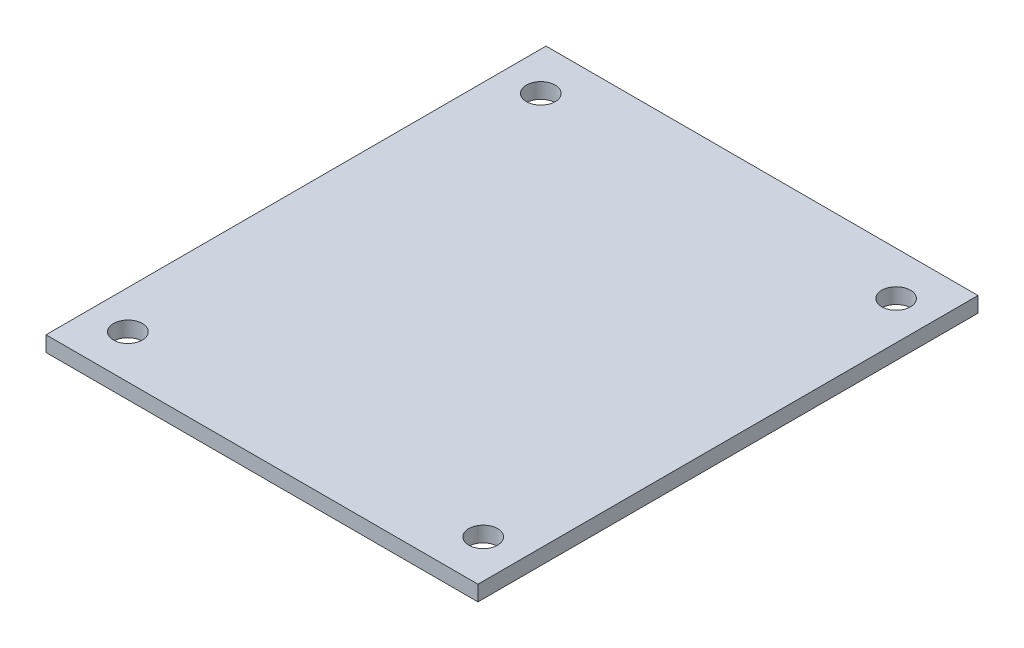
ISO-10303-21;
HEADER;
FILE_DESCRIPTION(('STEP AP214'),'2;1');
FILE_NAME('part.step','',(''),(''),'','','');
FILE_SCHEMA(('AUTOMOTIVE_DESIGN { 1 0 10303 214 1 1 1 1 }'));
ENDSEC;
DATA;
#1=APPLICATION_CONTEXT('core data for automotive mechanical design processes');
#2=APPLICATION_PROTOCOL_DEFINITION('international standard','automotive_design',2000,#1);
#3=PRODUCT_CONTEXT('',#1,'mechanical');
#4=PRODUCT('Part','Part','',(#3));
#5=PRODUCT_RELATED_PRODUCT_CATEGORY('part','',(#4));
#6=PRODUCT_DEFINITION_FORMATION('','',#4);
#7=PRODUCT_DEFINITION_CONTEXT('part definition',#1,'design');
#8=PRODUCT_DEFINITION('design','',#6,#7);
#9=PRODUCT_DEFINITION_SHAPE('','',#8);
#10=(LENGTH_UNIT() NAMED_UNIT(*) SI_UNIT(.MILLI.,.METRE.));
#11=(NAMED_UNIT(*) PLANE_ANGLE_UNIT() SI_UNIT($,.RADIAN.));
#12=(NAMED_UNIT(*) SI_UNIT($,.STERADIAN.) SOLID_ANGLE_UNIT());
#13=UNCERTAINTY_MEASURE_WITH_UNIT(LENGTH_MEASURE(1.E-05),#10,'distance_accuracy_value','');
#14=(GEOMETRIC_REPRESENTATION_CONTEXT(3) GLOBAL_UNCERTAINTY_ASSIGNED_CONTEXT((#13)) GLOBAL_UNIT_ASSIGNED_CONTEXT((#10,
#11,#12)) REPRESENTATION_CONTEXT('',''));
#15=CARTESIAN_POINT('',(0.,0.,0.));
#16=DIRECTION('',(0.,0.,1.));
#17=DIRECTION('',(1.,0.,0.));
#18=AXIS2_PLACEMENT_3D('',#15,#16,#17);
#19=CARTESIAN_POINT('',(0.,1.6,0.));
#20=DIRECTION('',(0.,-1.,0.));
#21=DIRECTION('',(0.,0.,-1.));
#22=AXIS2_PLACEMENT_3D('',#19,#20,#21);
#23=PLANE('',#22);
#24=DIRECTION('',(0.,0.,1.));
#25=VECTOR('',#24,1.);
#26=CARTESIAN_POINT('',(0.,1.6,0.));
#27=LINE('',#26,#25);
#28=CARTESIAN_POINT('',(0.,1.6,-52.07));
#29=VERTEX_POINT('',#28);
#30=CARTESIAN_POINT('',(0.,1.6,0.));
#31=VERTEX_POINT('',#30);
#32=EDGE_CURVE('E88',#29,#31,#27,.T.);
#33=ORIENTED_EDGE('',*,*,#32,.T.);
#34=DIRECTION('',(1.,0.,0.));
#35=VECTOR('',#34,1.);
#36=CARTESIAN_POINT('',(0.,1.6,0.));
#37=LINE('',#36,#35);
#38=CARTESIAN_POINT('',(44.9834,1.6,0.));
#39=VERTEX_POINT('',#38);
#40=EDGE_CURVE('E83',#31,#39,#37,.T.);
#41=ORIENTED_EDGE('',*,*,#40,.T.);
#42=DIRECTION('',(0.,0.,-1.));
#43=VECTOR('',#42,1.);
#44=CARTESIAN_POINT('',(44.9834,1.6,0.));
#45=LINE('',#44,#43);
#46=CARTESIAN_POINT('',(44.9834,1.6,-52.07));
#47=VERTEX_POINT('',#46);
#48=EDGE_CURVE('E86',#39,#47,#45,.T.);
#49=ORIENTED_EDGE('',*,*,#48,.T.);
#50=DIRECTION('',(-1.,0.,0.));
#51=VECTOR('',#50,1.);
#52=CARTESIAN_POINT('',(0.,1.6,-52.07));
#53=LINE('',#52,#51);
#54=EDGE_CURVE('E53',#47,#29,#53,.T.);
#55=ORIENTED_EDGE('',*,*,#54,.T.);
#56=EDGE_LOOP('',(#33,#41,#49,#55));
#57=FACE_BOUND('',#56,.T.);
#58=CARTESIAN_POINT('',(3.9917,1.6,-47.535));
#59=DIRECTION('',(0.,1.,0.));
#60=DIRECTION('',(0.,0.,1.));
#61=AXIS2_PLACEMENT_3D('',#58,#59,#60);
#62=CIRCLE('',#61,1.5);
#63=CARTESIAN_POINT('',(3.9917,1.6,-46.035));
#64=VERTEX_POINT('',#63);
#65=EDGE_CURVE('E103',#64,#64,#62,.T.);
#66=ORIENTED_EDGE('',*,*,#65,.F.);
#67=EDGE_LOOP('',(#66));
#68=FACE_BOUND('',#67,.T.);
#69=CARTESIAN_POINT('',(40.9917,1.6,-47.535));
#70=DIRECTION('',(0.,1.,0.));
#71=DIRECTION('',(0.,0.,1.));
#72=AXIS2_PLACEMENT_3D('',#69,#70,#71);
#73=CIRCLE('',#72,1.5);
#74=CARTESIAN_POINT('',(40.9917,1.6,-46.035));
#75=VERTEX_POINT('',#74);
#76=EDGE_CURVE('E118',#75,#75,#73,.T.);
#77=ORIENTED_EDGE('',*,*,#76,.F.);
#78=EDGE_LOOP('',(#77));
#79=FACE_BOUND('',#78,.T.);
#80=CARTESIAN_POINT('',(40.9917,1.6,-4.535));
#81=DIRECTION('',(0.,1.,0.));
#82=DIRECTION('',(0.,0.,1.));
#83=AXIS2_PLACEMENT_3D('',#80,#81,#82);
#84=CIRCLE('',#83,1.5);
#85=CARTESIAN_POINT('',(40.9917,1.6,-3.03499999999999));
#86=VERTEX_POINT('',#85);
#87=EDGE_CURVE('E124',#86,#86,#84,.T.);
#88=ORIENTED_EDGE('',*,*,#87,.F.);
#89=EDGE_LOOP('',(#88));
#90=FACE_BOUND('',#89,.T.);
#91=CARTESIAN_POINT('',(3.9917,1.6,-4.535));
#92=DIRECTION('',(0.,1.,0.));
#93=DIRECTION('',(0.,0.,1.));
#94=AXIS2_PLACEMENT_3D('',#91,#92,#93);
#95=CIRCLE('',#94,1.5);
#96=CARTESIAN_POINT('',(3.9917,1.6,-3.035));
#97=VERTEX_POINT('',#96);
#98=EDGE_CURVE('E130',#97,#97,#95,.T.);
#99=ORIENTED_EDGE('',*,*,#98,.F.);
#100=EDGE_LOOP('',(#99));
#101=FACE_BOUND('',#100,.T.);
#102=ADVANCED_FACE('F36',(#57,#68,#79,#90,#101),#23,.F.);
#103=CARTESIAN_POINT('',(0.,0.,0.));
#104=DIRECTION('',(0.,-1.,0.));
#105=DIRECTION('',(0.,0.,-1.));
#106=AXIS2_PLACEMENT_3D('',#103,#104,#105);
#107=PLANE('',#106);
#108=CARTESIAN_POINT('',(40.9917,0.,-4.535));
#109=DIRECTION('',(0.,1.,0.));
#110=DIRECTION('',(0.,0.,1.));
#111=AXIS2_PLACEMENT_3D('',#108,#109,#110);
#112=CIRCLE('',#111,1.5);
#113=CARTESIAN_POINT('',(40.9917,0.,-3.03499999999999));
#114=VERTEX_POINT('',#113);
#115=EDGE_CURVE('E127',#114,#114,#112,.T.);
#116=ORIENTED_EDGE('',*,*,#115,.T.);
#117=EDGE_LOOP('',(#116));
#118=FACE_BOUND('',#117,.T.);
#119=CARTESIAN_POINT('',(3.9917,0.,-47.535));
#120=DIRECTION('',(0.,1.,0.));
#121=DIRECTION('',(0.,0.,1.));
#122=AXIS2_PLACEMENT_3D('',#119,#120,#121);
#123=CIRCLE('',#122,1.5);
#124=CARTESIAN_POINT('',(3.9917,0.,-46.035));
#125=VERTEX_POINT('',#124);
#126=EDGE_CURVE('E115',#125,#125,#123,.T.);
#127=ORIENTED_EDGE('',*,*,#126,.T.);
#128=EDGE_LOOP('',(#127));
#129=FACE_BOUND('',#128,.T.);
#130=DIRECTION('',(0.,0.,1.));
#131=VECTOR('',#130,1.);
#132=CARTESIAN_POINT('',(0.,0.,0.));
#133=LINE('',#132,#131);
#134=CARTESIAN_POINT('',(0.,0.,-52.07));
#135=VERTEX_POINT('',#134);
#136=CARTESIAN_POINT('',(0.,0.,0.));
#137=VERTEX_POINT('',#136);
#138=EDGE_CURVE('E100',#135,#137,#133,.T.);
#139=ORIENTED_EDGE('',*,*,#138,.F.);
#140=DIRECTION('',(-1.,0.,0.));
#141=VECTOR('',#140,1.);
#142=CARTESIAN_POINT('',(0.,0.,-52.07));
#143=LINE('',#142,#141);
#144=CARTESIAN_POINT('',(44.9834,0.,-52.07));
#145=VERTEX_POINT('',#144);
#146=EDGE_CURVE('E76',#145,#135,#143,.T.);
#147=ORIENTED_EDGE('',*,*,#146,.F.);
#148=DIRECTION('',(0.,0.,-1.));
#149=VECTOR('',#148,1.);
#150=CARTESIAN_POINT('',(44.9834,0.,0.));
#151=LINE('',#150,#149);
#152=CARTESIAN_POINT('',(44.9834,0.,0.));
#153=VERTEX_POINT('',#152);
#154=EDGE_CURVE('E70',#153,#145,#151,.T.);
#155=ORIENTED_EDGE('',*,*,#154,.F.);
#156=DIRECTION('',(1.,0.,0.));
#157=VECTOR('',#156,1.);
#158=CARTESIAN_POINT('',(0.,0.,0.));
#159=LINE('',#158,#157);
#160=EDGE_CURVE('E92',#137,#153,#159,.T.);
#161=ORIENTED_EDGE('',*,*,#160,.F.);
#162=EDGE_LOOP('',(#139,#147,#155,#161));
#163=FACE_BOUND('',#162,.T.);
#164=CARTESIAN_POINT('',(40.9917,0.,-47.535));
#165=DIRECTION('',(0.,1.,0.));
#166=DIRECTION('',(0.,0.,1.));
#167=AXIS2_PLACEMENT_3D('',#164,#165,#166);
#168=CIRCLE('',#167,1.5);
#169=CARTESIAN_POINT('',(40.9917,0.,-46.035));
#170=VERTEX_POINT('',#169);
#171=EDGE_CURVE('E121',#170,#170,#168,.T.);
#172=ORIENTED_EDGE('',*,*,#171,.T.);
#173=EDGE_LOOP('',(#172));
#174=FACE_BOUND('',#173,.T.);
#175=CARTESIAN_POINT('',(3.9917,0.,-4.535));
#176=DIRECTION('',(0.,1.,0.));
#177=DIRECTION('',(0.,0.,1.));
#178=AXIS2_PLACEMENT_3D('',#175,#176,#177);
#179=CIRCLE('',#178,1.5);
#180=CARTESIAN_POINT('',(3.9917,0.,-3.035));
#181=VERTEX_POINT('',#180);
#182=EDGE_CURVE('E133',#181,#181,#179,.T.);
#183=ORIENTED_EDGE('',*,*,#182,.T.);
#184=EDGE_LOOP('',(#183));
#185=FACE_BOUND('',#184,.T.);
#186=ADVANCED_FACE('F111',(#118,#129,#163,#174,#185),#107,.T.);
#187=CARTESIAN_POINT('',(0.,1.6,0.));
#188=DIRECTION('',(1.,0.,0.));
#189=DIRECTION('',(0.,0.,-1.));
#190=AXIS2_PLACEMENT_3D('',#187,#188,#189);
#191=PLANE('',#190);
#192=ORIENTED_EDGE('',*,*,#138,.T.);
#193=DIRECTION('',(0.,-1.,0.));
#194=VECTOR('',#193,1.);
#195=CARTESIAN_POINT('',(0.,1.6,0.));
#196=LINE('',#195,#194);
#197=EDGE_CURVE('E11',#31,#137,#196,.T.);
#198=ORIENTED_EDGE('',*,*,#197,.F.);
#199=ORIENTED_EDGE('',*,*,#32,.F.);
#200=DIRECTION('',(0.,-1.,0.));
#201=VECTOR('',#200,1.);
#202=CARTESIAN_POINT('',(0.,1.6,-52.07));
#203=LINE('',#202,#201);
#204=EDGE_CURVE('E96',#29,#135,#203,.T.);
#205=ORIENTED_EDGE('',*,*,#204,.T.);
#206=EDGE_LOOP('',(#192,#198,#199,#205));
#207=FACE_BOUND('',#206,.T.);
#208=ADVANCED_FACE('F38',(#207),#191,.F.);
#209=CARTESIAN_POINT('',(0.,1.6,0.));
#210=DIRECTION('',(0.,0.,-1.));
#211=DIRECTION('',(-1.,0.,0.));
#212=AXIS2_PLACEMENT_3D('',#209,#210,#211);
#213=PLANE('',#212);
#214=ORIENTED_EDGE('',*,*,#160,.T.);
#215=DIRECTION('',(0.,-1.,0.));
#216=VECTOR('',#215,1.);
#217=CARTESIAN_POINT('',(44.9834,1.6,0.));
#218=LINE('',#217,#216);
#219=EDGE_CURVE('E45',#39,#153,#218,.T.);
#220=ORIENTED_EDGE('',*,*,#219,.F.);
#221=ORIENTED_EDGE('',*,*,#40,.F.);
#222=ORIENTED_EDGE('',*,*,#197,.T.);
#223=EDGE_LOOP('',(#214,#220,#221,#222));
#224=FACE_BOUND('',#223,.T.);
#225=ADVANCED_FACE('F91',(#224),#213,.F.);
#226=CARTESIAN_POINT('',(44.9834,1.6,0.));
#227=DIRECTION('',(-1.,0.,0.));
#228=DIRECTION('',(0.,0.,1.));
#229=AXIS2_PLACEMENT_3D('',#226,#227,#228);
#230=PLANE('',#229);
#231=ORIENTED_EDGE('',*,*,#154,.T.);
#232=DIRECTION('',(0.,-1.,0.));
#233=VECTOR('',#232,1.);
#234=CARTESIAN_POINT('',(44.9834,1.6,-52.07));
#235=LINE('',#234,#233);
#236=EDGE_CURVE('E93',#47,#145,#235,.T.);
#237=ORIENTED_EDGE('',*,*,#236,.F.);
#238=ORIENTED_EDGE('',*,*,#48,.F.);
#239=ORIENTED_EDGE('',*,*,#219,.T.);
#240=EDGE_LOOP('',(#231,#237,#238,#239));
#241=FACE_BOUND('',#240,.T.);
#242=ADVANCED_FACE('F94',(#241),#230,.F.);
#243=CARTESIAN_POINT('',(0.,1.6,-52.07));
#244=DIRECTION('',(0.,0.,1.));
#245=DIRECTION('',(1.,0.,0.));
#246=AXIS2_PLACEMENT_3D('',#243,#244,#245);
#247=PLANE('',#246);
#248=ORIENTED_EDGE('',*,*,#146,.T.);
#249=ORIENTED_EDGE('',*,*,#204,.F.);
#250=ORIENTED_EDGE('',*,*,#54,.F.);
#251=ORIENTED_EDGE('',*,*,#236,.T.);
#252=EDGE_LOOP('',(#248,#249,#250,#251));
#253=FACE_BOUND('',#252,.T.);
#254=ADVANCED_FACE('F108',(#253),#247,.F.);
#255=CARTESIAN_POINT('',(3.9917,1.6,-47.535));
#256=DIRECTION('',(0.,-1.,0.));
#257=DIRECTION('',(0.,0.,-1.));
#258=AXIS2_PLACEMENT_3D('',#255,#256,#257);
#259=CYLINDRICAL_SURFACE('',#258,1.5);
#260=ORIENTED_EDGE('',*,*,#65,.T.);
#261=EDGE_LOOP('',(#260));
#262=FACE_BOUND('',#261,.T.);
#263=ORIENTED_EDGE('',*,*,#126,.F.);
#264=EDGE_LOOP('',(#263));
#265=FACE_BOUND('',#264,.T.);
#266=ADVANCED_FACE('F150',(#262,#265),#259,.F.);
#267=CARTESIAN_POINT('',(40.9917,1.6,-47.535));
#268=DIRECTION('',(0.,-1.,0.));
#269=DIRECTION('',(0.,0.,-1.));
#270=AXIS2_PLACEMENT_3D('',#267,#268,#269);
#271=CYLINDRICAL_SURFACE('',#270,1.5);
#272=ORIENTED_EDGE('',*,*,#76,.T.);
#273=EDGE_LOOP('',(#272));
#274=FACE_BOUND('',#273,.T.);
#275=ORIENTED_EDGE('',*,*,#171,.F.);
#276=EDGE_LOOP('',(#275));
#277=FACE_BOUND('',#276,.T.);
#278=ADVANCED_FACE('F205',(#274,#277),#271,.F.);
#279=CARTESIAN_POINT('',(40.9917,1.6,-4.535));
#280=DIRECTION('',(0.,-1.,0.));
#281=DIRECTION('',(0.,0.,-1.));
#282=AXIS2_PLACEMENT_3D('',#279,#280,#281);
#283=CYLINDRICAL_SURFACE('',#282,1.5);
#284=ORIENTED_EDGE('',*,*,#87,.T.);
#285=EDGE_LOOP('',(#284));
#286=FACE_BOUND('',#285,.T.);
#287=ORIENTED_EDGE('',*,*,#115,.F.);
#288=EDGE_LOOP('',(#287));
#289=FACE_BOUND('',#288,.T.);
#290=ADVANCED_FACE('F214',(#286,#289),#283,.F.);
#291=CARTESIAN_POINT('',(3.9917,1.6,-4.535));
#292=DIRECTION('',(0.,-1.,0.));
#293=DIRECTION('',(0.,0.,-1.));
#294=AXIS2_PLACEMENT_3D('',#291,#292,#293);
#295=CYLINDRICAL_SURFACE('',#294,1.5);
#296=ORIENTED_EDGE('',*,*,#98,.T.);
#297=EDGE_LOOP('',(#296));
#298=FACE_BOUND('',#297,.T.);
#299=ORIENTED_EDGE('',*,*,#182,.F.);
#300=EDGE_LOOP('',(#299));
#301=FACE_BOUND('',#300,.T.);
#302=ADVANCED_FACE('F139',(#298,#301),#295,.F.);
#303=CLOSED_SHELL('',(#102,#186,#208,#225,#242,#254,#266,#278,#290,#302));
#304=MANIFOLD_SOLID_BREP('B2',#303);
#305=ADVANCED_BREP_SHAPE_REPRESENTATION('',(#18,#304),#14);
#306=SHAPE_DEFINITION_REPRESENTATION(#9,#305);
ENDSEC;
END-ISO-10303-21;
